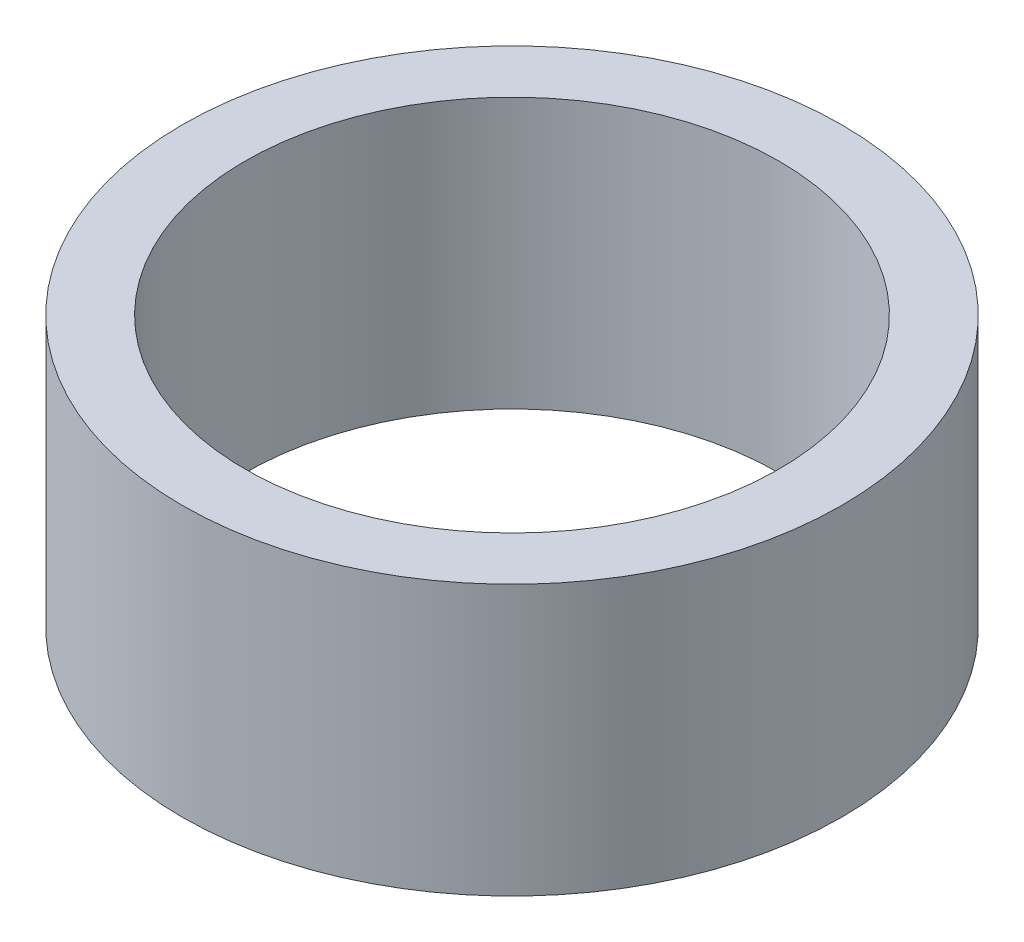
ISO-10303-21;
HEADER;
FILE_DESCRIPTION(('STEP AP214'),'2;1');
FILE_NAME('part.step','',(''),(''),'','','');
FILE_SCHEMA(('AUTOMOTIVE_DESIGN { 1 0 10303 214 1 1 1 1 }'));
ENDSEC;
DATA;
#1=APPLICATION_CONTEXT('core data for automotive mechanical design processes');
#2=APPLICATION_PROTOCOL_DEFINITION('international standard','automotive_design',2000,#1);
#3=PRODUCT_CONTEXT('',#1,'mechanical');
#4=PRODUCT('Part','Part','',(#3));
#5=PRODUCT_RELATED_PRODUCT_CATEGORY('part','',(#4));
#6=PRODUCT_DEFINITION_FORMATION('','',#4);
#7=PRODUCT_DEFINITION_CONTEXT('part definition',#1,'design');
#8=PRODUCT_DEFINITION('design','',#6,#7);
#9=PRODUCT_DEFINITION_SHAPE('','',#8);
#10=(LENGTH_UNIT() NAMED_UNIT(*) SI_UNIT(.MILLI.,.METRE.));
#11=(NAMED_UNIT(*) PLANE_ANGLE_UNIT() SI_UNIT($,.RADIAN.));
#12=(NAMED_UNIT(*) SI_UNIT($,.STERADIAN.) SOLID_ANGLE_UNIT());
#13=UNCERTAINTY_MEASURE_WITH_UNIT(LENGTH_MEASURE(1.E-05),#10,'distance_accuracy_value','');
#14=(GEOMETRIC_REPRESENTATION_CONTEXT(3) GLOBAL_UNCERTAINTY_ASSIGNED_CONTEXT((#13)) GLOBAL_UNIT_ASSIGNED_CONTEXT((#10,
#11,#12)) REPRESENTATION_CONTEXT('',''));
#15=CARTESIAN_POINT('',(0.,0.,0.));
#16=DIRECTION('',(0.,0.,1.));
#17=DIRECTION('',(1.,0.,0.));
#18=AXIS2_PLACEMENT_3D('',#15,#16,#17);
#19=CARTESIAN_POINT('',(0.,25.8,0.));
#20=DIRECTION('',(0.,1.,0.));
#21=DIRECTION('',(0.,0.,1.));
#22=AXIS2_PLACEMENT_3D('',#19,#20,#21);
#23=PLANE('',#22);
#24=CARTESIAN_POINT('',(0.,25.8,0.));
#25=DIRECTION('',(0.,1.,0.));
#26=DIRECTION('',(0.,0.,1.));
#27=AXIS2_PLACEMENT_3D('',#24,#25,#26);
#28=CIRCLE('',#27,31.5);
#29=CARTESIAN_POINT('',(0.,25.8,-31.5));
#30=VERTEX_POINT('',#29);
#31=EDGE_CURVE('E10',#30,#30,#28,.T.);
#32=ORIENTED_EDGE('',*,*,#31,.T.);
#33=EDGE_LOOP('',(#32));
#34=FACE_BOUND('',#33,.T.);
#35=CARTESIAN_POINT('',(0.,25.8,0.));
#36=DIRECTION('',(0.,1.,0.));
#37=DIRECTION('',(0.,0.,1.));
#38=AXIS2_PLACEMENT_3D('',#35,#36,#37);
#39=CIRCLE('',#38,25.5);
#40=CARTESIAN_POINT('',(0.,25.8,-25.5));
#41=VERTEX_POINT('',#40);
#42=EDGE_CURVE('E46',#41,#41,#39,.T.);
#43=ORIENTED_EDGE('',*,*,#42,.F.);
#44=EDGE_LOOP('',(#43));
#45=FACE_BOUND('',#44,.T.);
#46=ADVANCED_FACE('F35',(#34,#45),#23,.T.);
#47=CARTESIAN_POINT('',(0.,0.,0.));
#48=DIRECTION('',(0.,1.,0.));
#49=DIRECTION('',(0.,0.,1.));
#50=AXIS2_PLACEMENT_3D('',#47,#48,#49);
#51=PLANE('',#50);
#52=CARTESIAN_POINT('',(0.,0.,0.));
#53=DIRECTION('',(0.,1.,0.));
#54=DIRECTION('',(0.,0.,1.));
#55=AXIS2_PLACEMENT_3D('',#52,#53,#54);
#56=CIRCLE('',#55,31.5);
#57=CARTESIAN_POINT('',(0.,0.,-31.5));
#58=VERTEX_POINT('',#57);
#59=EDGE_CURVE('E39',#58,#58,#56,.T.);
#60=ORIENTED_EDGE('',*,*,#59,.F.);
#61=EDGE_LOOP('',(#60));
#62=FACE_BOUND('',#61,.T.);
#63=CARTESIAN_POINT('',(0.,0.,0.));
#64=DIRECTION('',(0.,1.,0.));
#65=DIRECTION('',(0.,0.,1.));
#66=AXIS2_PLACEMENT_3D('',#63,#64,#65);
#67=CIRCLE('',#66,25.5);
#68=CARTESIAN_POINT('',(0.,0.,-25.5));
#69=VERTEX_POINT('',#68);
#70=EDGE_CURVE('E48',#69,#69,#67,.T.);
#71=ORIENTED_EDGE('',*,*,#70,.T.);
#72=EDGE_LOOP('',(#71));
#73=FACE_BOUND('',#72,.T.);
#74=ADVANCED_FACE('F58',(#62,#73),#51,.F.);
#75=CARTESIAN_POINT('',(0.,25.8,0.));
#76=DIRECTION('',(0.,-1.,0.));
#77=DIRECTION('',(0.,0.,-1.));
#78=AXIS2_PLACEMENT_3D('',#75,#76,#77);
#79=CYLINDRICAL_SURFACE('',#78,31.5);
#80=CARTESIAN_POINT('',(0.,25.8,-31.5));
#81=CARTESIAN_POINT('',(0.,25.53125,-31.5));
#82=CARTESIAN_POINT('',(0.,25.2625,-31.5));
#83=CARTESIAN_POINT('',(0.,24.725,-31.5));
#84=CARTESIAN_POINT('',(0.,24.45625,-31.5));
#85=CARTESIAN_POINT('',(0.,23.91875,-31.5));
#86=CARTESIAN_POINT('',(0.,23.65,-31.5));
#87=CARTESIAN_POINT('',(0.,23.1125,-31.5));
#88=CARTESIAN_POINT('',(0.,22.84375,-31.5));
#89=CARTESIAN_POINT('',(0.,22.30625,-31.5));
#90=CARTESIAN_POINT('',(0.,22.0375,-31.5));
#91=CARTESIAN_POINT('',(0.,21.5,-31.5));
#92=CARTESIAN_POINT('',(0.,21.23125,-31.5));
#93=CARTESIAN_POINT('',(0.,20.69375,-31.5));
#94=CARTESIAN_POINT('',(0.,20.425,-31.5));
#95=CARTESIAN_POINT('',(0.,19.8875,-31.5));
#96=CARTESIAN_POINT('',(0.,19.61875,-31.5));
#97=CARTESIAN_POINT('',(0.,19.08125,-31.5));
#98=CARTESIAN_POINT('',(0.,18.8125,-31.5));
#99=CARTESIAN_POINT('',(0.,18.275,-31.5));
#100=CARTESIAN_POINT('',(0.,18.00625,-31.5));
#101=CARTESIAN_POINT('',(0.,17.46875,-31.5));
#102=CARTESIAN_POINT('',(0.,17.2,-31.5));
#103=CARTESIAN_POINT('',(0.,16.6625,-31.5));
#104=CARTESIAN_POINT('',(0.,16.39375,-31.5));
#105=CARTESIAN_POINT('',(0.,15.85625,-31.5));
#106=CARTESIAN_POINT('',(0.,15.5875,-31.5));
#107=CARTESIAN_POINT('',(0.,15.05,-31.5));
#108=CARTESIAN_POINT('',(0.,14.78125,-31.5));
#109=CARTESIAN_POINT('',(0.,14.24375,-31.5));
#110=CARTESIAN_POINT('',(0.,13.975,-31.5));
#111=CARTESIAN_POINT('',(0.,13.4375,-31.5));
#112=CARTESIAN_POINT('',(0.,13.16875,-31.5));
#113=CARTESIAN_POINT('',(0.,12.63125,-31.5));
#114=CARTESIAN_POINT('',(0.,12.3625,-31.5));
#115=CARTESIAN_POINT('',(0.,11.825,-31.5));
#116=CARTESIAN_POINT('',(0.,11.55625,-31.5));
#117=CARTESIAN_POINT('',(0.,11.01875,-31.5));
#118=CARTESIAN_POINT('',(0.,10.75,-31.5));
#119=CARTESIAN_POINT('',(0.,10.2125,-31.5));
#120=CARTESIAN_POINT('',(0.,9.94375,-31.5));
#121=CARTESIAN_POINT('',(0.,9.40625,-31.5));
#122=CARTESIAN_POINT('',(0.,9.1375,-31.5));
#123=CARTESIAN_POINT('',(0.,8.6,-31.5));
#124=CARTESIAN_POINT('',(0.,8.33125,-31.5));
#125=CARTESIAN_POINT('',(0.,7.79375,-31.5));
#126=CARTESIAN_POINT('',(0.,7.525,-31.5));
#127=CARTESIAN_POINT('',(0.,6.9875,-31.5));
#128=CARTESIAN_POINT('',(0.,6.71875,-31.5));
#129=CARTESIAN_POINT('',(0.,6.18125,-31.5));
#130=CARTESIAN_POINT('',(0.,5.9125,-31.5));
#131=CARTESIAN_POINT('',(0.,5.375,-31.5));
#132=CARTESIAN_POINT('',(0.,5.10625,-31.5));
#133=CARTESIAN_POINT('',(0.,4.56875,-31.5));
#134=CARTESIAN_POINT('',(0.,4.3,-31.5));
#135=CARTESIAN_POINT('',(0.,3.7625,-31.5));
#136=CARTESIAN_POINT('',(0.,3.49375,-31.5));
#137=CARTESIAN_POINT('',(0.,2.95625,-31.5));
#138=CARTESIAN_POINT('',(0.,2.6875,-31.5));
#139=CARTESIAN_POINT('',(0.,2.15,-31.5));
#140=CARTESIAN_POINT('',(0.,1.88125,-31.5));
#141=CARTESIAN_POINT('',(0.,1.34375,-31.5));
#142=CARTESIAN_POINT('',(0.,1.075,-31.5));
#143=CARTESIAN_POINT('',(0.,0.537500000000001,-31.5));
#144=CARTESIAN_POINT('',(0.,0.268750000000001,-31.5));
#145=CARTESIAN_POINT('',(0.,0.,-31.5));
#146=B_SPLINE_CURVE_WITH_KNOTS('',3,(#80,#81,#82,#83,#84,#85,#86,#87,#88,#89,#90,#91,#92,#93,
#94,#95,#96,#97,#98,#99,#100,#101,#102,#103,#104,#105,#106,#107,#108,#109,#110,#111,#112,#113,
#114,#115,#116,#117,#118,#119,#120,#121,#122,#123,#124,#125,#126,#127,#128,#129,#130,#131,#132,
#133,#134,#135,#136,#137,#138,#139,#140,#141,#142,#143,#144,#145),.UNSPECIFIED.,.F.,.F.,(4,2,2,
2,2,2,2,2,2,2,2,2,2,2,2,2,2,2,2,2,2,2,2,2,2,2,2,2,2,2,2,2,4),(0.,0.806249999999998,1.6125,
2.41875,3.225,4.03125,4.8375,5.64375,6.45,7.25625,8.0625,8.86875,9.675,10.48125,11.2875,
12.09375,12.9,13.70625,14.5125,15.31875,16.125,16.93125,17.7375,18.54375,19.35,20.15625,20.9625,
21.76875,22.575,23.38125,24.1875,24.99375,25.8),.UNSPECIFIED.);
#147=EDGE_CURVE('BSEAM37',#30,#58,#146,.T.);
#148=ORIENTED_EDGE('',*,*,#31,.F.);
#149=ORIENTED_EDGE('',*,*,#59,.T.);
#150=ORIENTED_EDGE('',*,*,#147,.T.);
#151=ORIENTED_EDGE('',*,*,#147,.F.);
#152=EDGE_LOOP('',(#148,#150,#149,#151));
#153=FACE_BOUND('',#152,.T.);
#154=ADVANCED_FACE('F37',(#153),#79,.T.);
#155=CARTESIAN_POINT('',(0.,25.8,0.));
#156=DIRECTION('',(0.,-1.,0.));
#157=DIRECTION('',(0.,0.,-1.));
#158=AXIS2_PLACEMENT_3D('',#155,#156,#157);
#159=CYLINDRICAL_SURFACE('',#158,25.5);
#160=CARTESIAN_POINT('',(0.,25.8,-25.5));
#161=CARTESIAN_POINT('',(0.,25.53125,-25.5));
#162=CARTESIAN_POINT('',(0.,25.2625,-25.5));
#163=CARTESIAN_POINT('',(0.,24.725,-25.5));
#164=CARTESIAN_POINT('',(0.,24.45625,-25.5));
#165=CARTESIAN_POINT('',(0.,23.91875,-25.5));
#166=CARTESIAN_POINT('',(0.,23.65,-25.5));
#167=CARTESIAN_POINT('',(0.,23.1125,-25.5));
#168=CARTESIAN_POINT('',(0.,22.84375,-25.5));
#169=CARTESIAN_POINT('',(0.,22.30625,-25.5));
#170=CARTESIAN_POINT('',(0.,22.0375,-25.5));
#171=CARTESIAN_POINT('',(0.,21.5,-25.5));
#172=CARTESIAN_POINT('',(0.,21.23125,-25.5));
#173=CARTESIAN_POINT('',(0.,20.69375,-25.5));
#174=CARTESIAN_POINT('',(0.,20.425,-25.5));
#175=CARTESIAN_POINT('',(0.,19.8875,-25.5));
#176=CARTESIAN_POINT('',(0.,19.61875,-25.5));
#177=CARTESIAN_POINT('',(0.,19.08125,-25.5));
#178=CARTESIAN_POINT('',(0.,18.8125,-25.5));
#179=CARTESIAN_POINT('',(0.,18.275,-25.5));
#180=CARTESIAN_POINT('',(0.,18.00625,-25.5));
#181=CARTESIAN_POINT('',(0.,17.46875,-25.5));
#182=CARTESIAN_POINT('',(0.,17.2,-25.5));
#183=CARTESIAN_POINT('',(0.,16.6625,-25.5));
#184=CARTESIAN_POINT('',(0.,16.39375,-25.5));
#185=CARTESIAN_POINT('',(0.,15.85625,-25.5));
#186=CARTESIAN_POINT('',(0.,15.5875,-25.5));
#187=CARTESIAN_POINT('',(0.,15.05,-25.5));
#188=CARTESIAN_POINT('',(0.,14.78125,-25.5));
#189=CARTESIAN_POINT('',(0.,14.24375,-25.5));
#190=CARTESIAN_POINT('',(0.,13.975,-25.5));
#191=CARTESIAN_POINT('',(0.,13.4375,-25.5));
#192=CARTESIAN_POINT('',(0.,13.16875,-25.5));
#193=CARTESIAN_POINT('',(0.,12.63125,-25.5));
#194=CARTESIAN_POINT('',(0.,12.3625,-25.5));
#195=CARTESIAN_POINT('',(0.,11.825,-25.5));
#196=CARTESIAN_POINT('',(0.,11.55625,-25.5));
#197=CARTESIAN_POINT('',(0.,11.01875,-25.5));
#198=CARTESIAN_POINT('',(0.,10.75,-25.5));
#199=CARTESIAN_POINT('',(0.,10.2125,-25.5));
#200=CARTESIAN_POINT('',(0.,9.94375,-25.5));
#201=CARTESIAN_POINT('',(0.,9.40625,-25.5));
#202=CARTESIAN_POINT('',(0.,9.1375,-25.5));
#203=CARTESIAN_POINT('',(0.,8.6,-25.5));
#204=CARTESIAN_POINT('',(0.,8.33125,-25.5));
#205=CARTESIAN_POINT('',(0.,7.79375,-25.5));
#206=CARTESIAN_POINT('',(0.,7.525,-25.5));
#207=CARTESIAN_POINT('',(0.,6.9875,-25.5));
#208=CARTESIAN_POINT('',(0.,6.71875,-25.5));
#209=CARTESIAN_POINT('',(0.,6.18125,-25.5));
#210=CARTESIAN_POINT('',(0.,5.9125,-25.5));
#211=CARTESIAN_POINT('',(0.,5.375,-25.5));
#212=CARTESIAN_POINT('',(0.,5.10625,-25.5));
#213=CARTESIAN_POINT('',(0.,4.56875,-25.5));
#214=CARTESIAN_POINT('',(0.,4.3,-25.5));
#215=CARTESIAN_POINT('',(0.,3.7625,-25.5));
#216=CARTESIAN_POINT('',(0.,3.49375,-25.5));
#217=CARTESIAN_POINT('',(0.,2.95625,-25.5));
#218=CARTESIAN_POINT('',(0.,2.6875,-25.5));
#219=CARTESIAN_POINT('',(0.,2.15,-25.5));
#220=CARTESIAN_POINT('',(0.,1.88125,-25.5));
#221=CARTESIAN_POINT('',(0.,1.34375,-25.5));
#222=CARTESIAN_POINT('',(0.,1.075,-25.5));
#223=CARTESIAN_POINT('',(0.,0.537500000000001,-25.5));
#224=CARTESIAN_POINT('',(0.,0.268750000000001,-25.5));
#225=CARTESIAN_POINT('',(0.,0.,-25.5));
#226=B_SPLINE_CURVE_WITH_KNOTS('',3,(#160,#161,#162,#163,#164,#165,#166,#167,#168,#169,#170,
#171,#172,#173,#174,#175,#176,#177,#178,#179,#180,#181,#182,#183,#184,#185,#186,#187,#188,#189,
#190,#191,#192,#193,#194,#195,#196,#197,#198,#199,#200,#201,#202,#203,#204,#205,#206,#207,#208,
#209,#210,#211,#212,#213,#214,#215,#216,#217,#218,#219,#220,#221,#222,#223,#224,#225),
.UNSPECIFIED.,.F.,.F.,(4,2,2,2,2,2,2,2,2,2,2,2,2,2,2,2,2,2,2,2,2,2,2,2,2,2,2,2,2,2,2,2,4),(0.,
0.806249999999998,1.6125,2.41875,3.225,4.03125,4.8375,5.64375,6.45,7.25625,8.0625,8.86875,9.675,
10.48125,11.2875,12.09375,12.9,13.70625,14.5125,15.31875,16.125,16.93125,17.7375,18.54375,19.35,
20.15625,20.9625,21.76875,22.575,23.38125,24.1875,24.99375,25.8),.UNSPECIFIED.);
#227=EDGE_CURVE('BSEAM54',#41,#69,#226,.T.);
#228=ORIENTED_EDGE('',*,*,#42,.T.);
#229=ORIENTED_EDGE('',*,*,#70,.F.);
#230=ORIENTED_EDGE('',*,*,#227,.T.);
#231=ORIENTED_EDGE('',*,*,#227,.F.);
#232=EDGE_LOOP('',(#228,#230,#229,#231));
#233=FACE_BOUND('',#232,.T.);
#234=ADVANCED_FACE('F54',(#233),#159,.F.);
#235=CLOSED_SHELL('',(#46,#74,#154,#234));
#236=MANIFOLD_SOLID_BREP('B2',#235);
#237=ADVANCED_BREP_SHAPE_REPRESENTATION('',(#18,#236),#14);
#238=SHAPE_DEFINITION_REPRESENTATION(#9,#237);
ENDSEC;
END-ISO-10303-21;
